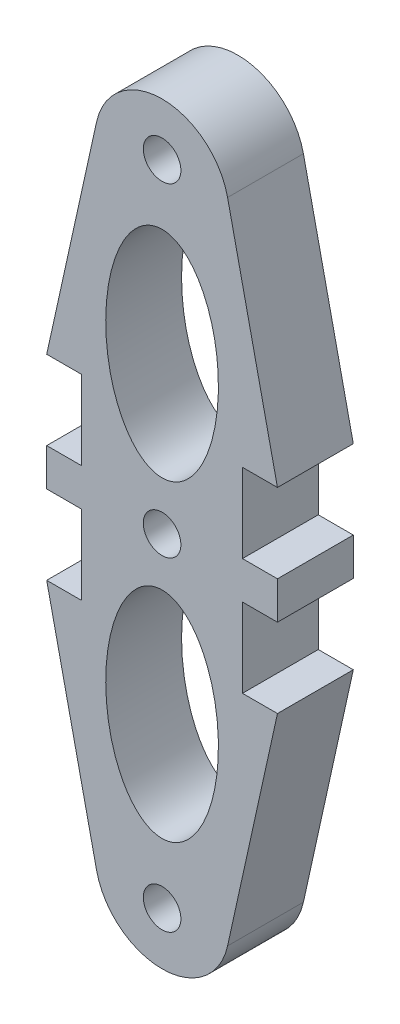
ISO-10303-21;
HEADER;
FILE_DESCRIPTION(('STEP AP214'),'2;1');
FILE_NAME('part.step','',(''),(''),'','','');
FILE_SCHEMA(('AUTOMOTIVE_DESIGN { 1 0 10303 214 1 1 1 1 }'));
ENDSEC;
DATA;
#1=APPLICATION_CONTEXT('core data for automotive mechanical design processes');
#2=APPLICATION_PROTOCOL_DEFINITION('international standard','automotive_design',2000,#1);
#3=PRODUCT_CONTEXT('',#1,'mechanical');
#4=PRODUCT('Part','Part','',(#3));
#5=PRODUCT_RELATED_PRODUCT_CATEGORY('part','',(#4));
#6=PRODUCT_DEFINITION_FORMATION('','',#4);
#7=PRODUCT_DEFINITION_CONTEXT('part definition',#1,'design');
#8=PRODUCT_DEFINITION('design','',#6,#7);
#9=PRODUCT_DEFINITION_SHAPE('','',#8);
#10=(LENGTH_UNIT() NAMED_UNIT(*) SI_UNIT(.MILLI.,.METRE.));
#11=(NAMED_UNIT(*) PLANE_ANGLE_UNIT() SI_UNIT($,.RADIAN.));
#12=(NAMED_UNIT(*) SI_UNIT($,.STERADIAN.) SOLID_ANGLE_UNIT());
#13=UNCERTAINTY_MEASURE_WITH_UNIT(LENGTH_MEASURE(1.E-05),#10,'distance_accuracy_value','');
#14=(GEOMETRIC_REPRESENTATION_CONTEXT(3) GLOBAL_UNCERTAINTY_ASSIGNED_CONTEXT((#13)) GLOBAL_UNIT_ASSIGNED_CONTEXT((#10,
#11,#12)) REPRESENTATION_CONTEXT('',''));
#15=CARTESIAN_POINT('',(0.,0.,0.));
#16=DIRECTION('',(0.,0.,1.));
#17=DIRECTION('',(1.,0.,0.));
#18=AXIS2_PLACEMENT_3D('',#15,#16,#17);
#19=CARTESIAN_POINT('',(838.504600485866,184.873607744956,5.85));
#20=DIRECTION('',(0.976545974076445,0.215308988467939,0.));
#21=DIRECTION('',(-0.215308988467939,0.976545974076445,0.));
#22=AXIS2_PLACEMENT_3D('',#19,#20,#21);
#23=PLANE('',#22);
#24=DIRECTION('',(0.215308988467939,-0.976545974076445,0.));
#25=VECTOR('',#24,1.);
#26=CARTESIAN_POINT('',(838.504600485866,184.873607744956,0.));
#27=LINE('',#26,#25);
#28=CARTESIAN_POINT('',(778.759168708765,455.852359196733,0.));
#29=VERTEX_POINT('',#28);
#30=CARTESIAN_POINT('',(782.606547069337,438.402359196733,0.));
#31=VERTEX_POINT('',#30);
#32=EDGE_CURVE('E314',#29,#31,#27,.T.);
#33=ORIENTED_EDGE('',*,*,#32,.T.);
#34=DIRECTION('',(0.,0.,-1.));
#35=VECTOR('',#34,1.);
#36=CARTESIAN_POINT('',(782.606547069337,438.402359196733,5.85));
#37=LINE('',#36,#35);
#38=CARTESIAN_POINT('',(782.606547069337,438.402359196733,5.85));
#39=VERTEX_POINT('',#38);
#40=EDGE_CURVE('E11',#39,#31,#37,.T.);
#41=ORIENTED_EDGE('',*,*,#40,.F.);
#42=DIRECTION('',(0.215308988467939,-0.976545974076445,0.));
#43=VECTOR('',#42,1.);
#44=CARTESIAN_POINT('',(838.504600485866,184.873607744956,5.85));
#45=LINE('',#44,#43);
#46=CARTESIAN_POINT('',(778.759168708765,455.852359196733,5.85));
#47=VERTEX_POINT('',#46);
#48=EDGE_CURVE('E469',#47,#39,#45,.T.);
#49=ORIENTED_EDGE('',*,*,#48,.F.);
#50=DIRECTION('',(0.,0.,-1.));
#51=VECTOR('',#50,1.);
#52=CARTESIAN_POINT('',(778.759168708765,455.852359196733,5.85));
#53=LINE('',#52,#51);
#54=EDGE_CURVE('E379',#47,#29,#53,.T.);
#55=ORIENTED_EDGE('',*,*,#54,.T.);
#56=EDGE_LOOP('',(#33,#41,#49,#55));
#57=FACE_BOUND('',#56,.T.);
#58=ADVANCED_FACE('F35',(#57),#23,.F.);
#59=CARTESIAN_POINT('',(787.659168708765,439.516361899294,5.85));
#60=DIRECTION('',(0.,0.,-1.));
#61=DIRECTION('',(-1.,0.,0.));
#62=AXIS2_PLACEMENT_3D('',#59,#60,#61);
#63=CYLINDRICAL_SURFACE('',#62,5.17397211555384);
#64=CARTESIAN_POINT('',(787.659168708765,439.516361899294,0.));
#65=DIRECTION('',(0.,0.,1.));
#66=DIRECTION('',(1.,0.,0.));
#67=AXIS2_PLACEMENT_3D('',#64,#65,#66);
#68=CIRCLE('',#67,5.17397211555384);
#69=CARTESIAN_POINT('',(792.711790348193,438.402359196733,0.));
#70=VERTEX_POINT('',#69);
#71=EDGE_CURVE('E318',#31,#70,#68,.T.);
#72=ORIENTED_EDGE('',*,*,#71,.T.);
#73=DIRECTION('',(0.,0.,-1.));
#74=VECTOR('',#73,1.);
#75=CARTESIAN_POINT('',(792.711790348193,438.402359196733,5.85));
#76=LINE('',#75,#74);
#77=CARTESIAN_POINT('',(792.711790348193,438.402359196733,5.85));
#78=VERTEX_POINT('',#77);
#79=EDGE_CURVE('E44',#78,#70,#76,.T.);
#80=ORIENTED_EDGE('',*,*,#79,.F.);
#81=CARTESIAN_POINT('',(787.659168708765,439.516361899294,5.85));
#82=DIRECTION('',(0.,0.,1.));
#83=DIRECTION('',(1.,0.,0.));
#84=AXIS2_PLACEMENT_3D('',#81,#82,#83);
#85=CIRCLE('',#84,5.17397211555384);
#86=EDGE_CURVE('E130',#39,#78,#85,.T.);
#87=ORIENTED_EDGE('',*,*,#86,.F.);
#88=ORIENTED_EDGE('',*,*,#40,.T.);
#89=EDGE_LOOP('',(#72,#80,#87,#88));
#90=FACE_BOUND('',#89,.T.);
#91=ADVANCED_FACE('F294',(#90),#63,.T.);
#92=CARTESIAN_POINT('',(663.78519164697,-146.351448848754,5.85));
#93=DIRECTION('',(-0.976545974076445,0.215308988467939,0.));
#94=DIRECTION('',(-0.215308988467939,-0.976545974076445,0.));
#95=AXIS2_PLACEMENT_3D('',#92,#93,#94);
#96=PLANE('',#95);
#97=DIRECTION('',(0.215308988467939,0.976545974076445,0.));
#98=VECTOR('',#97,1.);
#99=CARTESIAN_POINT('',(663.78519164697,-146.351448848754,0.));
#100=LINE('',#99,#98);
#101=CARTESIAN_POINT('',(796.559168708765,455.852359196733,0.));
#102=VERTEX_POINT('',#101);
#103=EDGE_CURVE('E323',#70,#102,#100,.T.);
#104=ORIENTED_EDGE('',*,*,#103,.T.);
#105=DIRECTION('',(0.,0.,-1.));
#106=VECTOR('',#105,1.);
#107=CARTESIAN_POINT('',(796.559168708765,455.852359196733,5.85));
#108=LINE('',#107,#106);
#109=CARTESIAN_POINT('',(796.559168708765,455.852359196733,5.85));
#110=VERTEX_POINT('',#109);
#111=EDGE_CURVE('E411',#110,#102,#108,.T.);
#112=ORIENTED_EDGE('',*,*,#111,.F.);
#113=DIRECTION('',(0.215308988467939,0.976545974076445,0.));
#114=VECTOR('',#113,1.);
#115=CARTESIAN_POINT('',(663.78519164697,-146.351448848754,5.85));
#116=LINE('',#115,#114);
#117=EDGE_CURVE('E416',#78,#110,#116,.T.);
#118=ORIENTED_EDGE('',*,*,#117,.F.);
#119=ORIENTED_EDGE('',*,*,#79,.T.);
#120=EDGE_LOOP('',(#104,#112,#118,#119));
#121=FACE_BOUND('',#120,.T.);
#122=ADVANCED_FACE('F290',(#121),#96,.F.);
#123=CARTESIAN_POINT('',(9.37218120388744E-12,455.852359196749,5.85));
#124=DIRECTION('',(0.,1.,0.));
#125=DIRECTION('',(-1.,0.,0.));
#126=AXIS2_PLACEMENT_3D('',#123,#124,#125);
#127=PLANE('',#126);
#128=DIRECTION('',(1.,0.,0.));
#129=VECTOR('',#128,1.);
#130=CARTESIAN_POINT('',(9.37218120388744E-12,455.852359196749,0.));
#131=LINE('',#130,#129);
#132=CARTESIAN_POINT('',(793.859168708765,455.852359196733,0.));
#133=VERTEX_POINT('',#132);
#134=EDGE_CURVE('E326',#133,#102,#131,.T.);
#135=ORIENTED_EDGE('',*,*,#134,.F.);
#136=DIRECTION('',(0.,0.,-1.));
#137=VECTOR('',#136,1.);
#138=CARTESIAN_POINT('',(793.859168708765,455.852359196733,5.85));
#139=LINE('',#138,#137);
#140=CARTESIAN_POINT('',(793.859168708765,455.852359196733,5.85));
#141=VERTEX_POINT('',#140);
#142=EDGE_CURVE('E409',#141,#133,#139,.T.);
#143=ORIENTED_EDGE('',*,*,#142,.F.);
#144=DIRECTION('',(1.,0.,0.));
#145=VECTOR('',#144,1.);
#146=CARTESIAN_POINT('',(9.37218120388744E-12,455.852359196749,5.85));
#147=LINE('',#146,#145);
#148=EDGE_CURVE('E426',#141,#110,#147,.T.);
#149=ORIENTED_EDGE('',*,*,#148,.T.);
#150=ORIENTED_EDGE('',*,*,#111,.T.);
#151=EDGE_LOOP('',(#135,#143,#149,#150));
#152=FACE_BOUND('',#151,.T.);
#153=ADVANCED_FACE('F286',(#152),#127,.T.);
#154=CARTESIAN_POINT('',(793.859168708765,0.,5.85));
#155=DIRECTION('',(1.,0.,0.));
#156=DIRECTION('',(0.,0.,-1.));
#157=AXIS2_PLACEMENT_3D('',#154,#155,#156);
#158=PLANE('',#157);
#159=DIRECTION('',(0.,-1.,0.));
#160=VECTOR('',#159,1.);
#161=CARTESIAN_POINT('',(793.859168708765,0.,0.));
#162=LINE('',#161,#160);
#163=CARTESIAN_POINT('',(793.859168708765,461.952359196733,0.));
#164=VERTEX_POINT('',#163);
#165=EDGE_CURVE('E329',#164,#133,#162,.T.);
#166=ORIENTED_EDGE('',*,*,#165,.F.);
#167=DIRECTION('',(0.,0.,-1.));
#168=VECTOR('',#167,1.);
#169=CARTESIAN_POINT('',(793.859168708765,461.952359196733,5.85));
#170=LINE('',#169,#168);
#171=CARTESIAN_POINT('',(793.859168708765,461.952359196733,5.85));
#172=VERTEX_POINT('',#171);
#173=EDGE_CURVE('E407',#172,#164,#170,.T.);
#174=ORIENTED_EDGE('',*,*,#173,.F.);
#175=DIRECTION('',(0.,-1.,0.));
#176=VECTOR('',#175,1.);
#177=CARTESIAN_POINT('',(793.859168708765,0.,5.85));
#178=LINE('',#177,#176);
#179=EDGE_CURVE('E429',#172,#141,#178,.T.);
#180=ORIENTED_EDGE('',*,*,#179,.T.);
#181=ORIENTED_EDGE('',*,*,#142,.T.);
#182=EDGE_LOOP('',(#166,#174,#180,#181));
#183=FACE_BOUND('',#182,.T.);
#184=ADVANCED_FACE('F282',(#183),#158,.T.);
#185=CARTESIAN_POINT('',(9.4975952862988E-12,461.952359196749,5.85));
#186=DIRECTION('',(0.,1.,0.));
#187=DIRECTION('',(-1.,0.,0.));
#188=AXIS2_PLACEMENT_3D('',#185,#186,#187);
#189=PLANE('',#188);
#190=DIRECTION('',(1.,0.,0.));
#191=VECTOR('',#190,1.);
#192=CARTESIAN_POINT('',(9.4975952862988E-12,461.952359196749,0.));
#193=LINE('',#192,#191);
#194=CARTESIAN_POINT('',(796.559168708765,461.952359196733,0.));
#195=VERTEX_POINT('',#194);
#196=EDGE_CURVE('E332',#164,#195,#193,.T.);
#197=ORIENTED_EDGE('',*,*,#196,.T.);
#198=DIRECTION('',(0.,0.,-1.));
#199=VECTOR('',#198,1.);
#200=CARTESIAN_POINT('',(796.559168708765,461.952359196733,5.85));
#201=LINE('',#200,#199);
#202=CARTESIAN_POINT('',(796.559168708765,461.952359196733,5.85));
#203=VERTEX_POINT('',#202);
#204=EDGE_CURVE('E405',#203,#195,#201,.T.);
#205=ORIENTED_EDGE('',*,*,#204,.F.);
#206=DIRECTION('',(1.,0.,0.));
#207=VECTOR('',#206,1.);
#208=CARTESIAN_POINT('',(9.4975952862988E-12,461.952359196749,5.85));
#209=LINE('',#208,#207);
#210=EDGE_CURVE('E431',#172,#203,#209,.T.);
#211=ORIENTED_EDGE('',*,*,#210,.F.);
#212=ORIENTED_EDGE('',*,*,#173,.T.);
#213=EDGE_LOOP('',(#197,#205,#211,#212));
#214=FACE_BOUND('',#213,.T.);
#215=ADVANCED_FACE('F278',(#214),#189,.F.);
#216=CARTESIAN_POINT('',(796.559168708765,0.,5.85));
#217=DIRECTION('',(1.,0.,0.));
#218=DIRECTION('',(0.,0.,-1.));
#219=AXIS2_PLACEMENT_3D('',#216,#217,#218);
#220=PLANE('',#219);
#221=DIRECTION('',(0.,-1.,0.));
#222=VECTOR('',#221,1.);
#223=CARTESIAN_POINT('',(796.559168708765,0.,0.));
#224=LINE('',#223,#222);
#225=CARTESIAN_POINT('',(796.559168708765,464.852359196733,0.));
#226=VERTEX_POINT('',#225);
#227=EDGE_CURVE('E335',#226,#195,#224,.T.);
#228=ORIENTED_EDGE('',*,*,#227,.F.);
#229=DIRECTION('',(0.,0.,-1.));
#230=VECTOR('',#229,1.);
#231=CARTESIAN_POINT('',(796.559168708765,464.852359196733,5.85));
#232=LINE('',#231,#230);
#233=CARTESIAN_POINT('',(796.559168708765,464.852359196733,5.85));
#234=VERTEX_POINT('',#233);
#235=EDGE_CURVE('E403',#234,#226,#232,.T.);
#236=ORIENTED_EDGE('',*,*,#235,.F.);
#237=DIRECTION('',(0.,-1.,0.));
#238=VECTOR('',#237,1.);
#239=CARTESIAN_POINT('',(796.559168708765,0.,5.85));
#240=LINE('',#239,#238);
#241=EDGE_CURVE('E437',#234,#203,#240,.T.);
#242=ORIENTED_EDGE('',*,*,#241,.T.);
#243=ORIENTED_EDGE('',*,*,#204,.T.);
#244=EDGE_LOOP('',(#228,#236,#242,#243));
#245=FACE_BOUND('',#244,.T.);
#246=ADVANCED_FACE('F274',(#245),#220,.T.);
#247=CARTESIAN_POINT('',(-9.55721837465762E-12,464.852359196716,5.85));
#248=DIRECTION('',(0.,1.,0.));
#249=DIRECTION('',(-1.,0.,0.));
#250=AXIS2_PLACEMENT_3D('',#247,#248,#249);
#251=PLANE('',#250);
#252=DIRECTION('',(1.,0.,0.));
#253=VECTOR('',#252,1.);
#254=CARTESIAN_POINT('',(-9.55721837465762E-12,464.852359196716,0.));
#255=LINE('',#254,#253);
#256=CARTESIAN_POINT('',(793.859168708765,464.852359196733,0.));
#257=VERTEX_POINT('',#256);
#258=EDGE_CURVE('E338',#257,#226,#255,.T.);
#259=ORIENTED_EDGE('',*,*,#258,.F.);
#260=DIRECTION('',(0.,0.,-1.));
#261=VECTOR('',#260,1.);
#262=CARTESIAN_POINT('',(793.859168708765,464.852359196733,5.85));
#263=LINE('',#262,#261);
#264=CARTESIAN_POINT('',(793.859168708765,464.852359196733,5.85));
#265=VERTEX_POINT('',#264);
#266=EDGE_CURVE('E401',#265,#257,#263,.T.);
#267=ORIENTED_EDGE('',*,*,#266,.F.);
#268=DIRECTION('',(1.,0.,0.));
#269=VECTOR('',#268,1.);
#270=CARTESIAN_POINT('',(-9.55721837465762E-12,464.852359196716,5.85));
#271=LINE('',#270,#269);
#272=EDGE_CURVE('E440',#265,#234,#271,.T.);
#273=ORIENTED_EDGE('',*,*,#272,.T.);
#274=ORIENTED_EDGE('',*,*,#235,.T.);
#275=EDGE_LOOP('',(#259,#267,#273,#274));
#276=FACE_BOUND('',#275,.T.);
#277=ADVANCED_FACE('F270',(#276),#251,.T.);
#278=CARTESIAN_POINT('',(793.859168708765,0.,5.85));
#279=DIRECTION('',(-1.,0.,0.));
#280=DIRECTION('',(0.,0.,1.));
#281=AXIS2_PLACEMENT_3D('',#278,#279,#280);
#282=PLANE('',#281);
#283=DIRECTION('',(0.,1.,0.));
#284=VECTOR('',#283,1.);
#285=CARTESIAN_POINT('',(793.859168708765,0.,0.));
#286=LINE('',#285,#284);
#287=CARTESIAN_POINT('',(793.859168708765,470.952359196733,0.));
#288=VERTEX_POINT('',#287);
#289=EDGE_CURVE('E341',#257,#288,#286,.T.);
#290=ORIENTED_EDGE('',*,*,#289,.T.);
#291=DIRECTION('',(0.,0.,-1.));
#292=VECTOR('',#291,1.);
#293=CARTESIAN_POINT('',(793.859168708765,470.952359196733,5.85));
#294=LINE('',#293,#292);
#295=CARTESIAN_POINT('',(793.859168708765,470.952359196733,5.85));
#296=VERTEX_POINT('',#295);
#297=EDGE_CURVE('E398',#296,#288,#294,.T.);
#298=ORIENTED_EDGE('',*,*,#297,.F.);
#299=DIRECTION('',(0.,1.,0.));
#300=VECTOR('',#299,1.);
#301=CARTESIAN_POINT('',(793.859168708765,0.,5.85));
#302=LINE('',#301,#300);
#303=EDGE_CURVE('E443',#265,#296,#302,.T.);
#304=ORIENTED_EDGE('',*,*,#303,.F.);
#305=ORIENTED_EDGE('',*,*,#266,.T.);
#306=EDGE_LOOP('',(#290,#298,#304,#305));
#307=FACE_BOUND('',#306,.T.);
#308=ADVANCED_FACE('F266',(#307),#282,.F.);
#309=CARTESIAN_POINT('',(-9.68263245706898E-12,470.952359196717,5.85));
#310=DIRECTION('',(0.,1.,0.));
#311=DIRECTION('',(-1.,0.,0.));
#312=AXIS2_PLACEMENT_3D('',#309,#310,#311);
#313=PLANE('',#312);
#314=DIRECTION('',(1.,0.,0.));
#315=VECTOR('',#314,1.);
#316=CARTESIAN_POINT('',(-9.68263245706898E-12,470.952359196717,0.));
#317=LINE('',#316,#315);
#318=CARTESIAN_POINT('',(796.559168708765,470.952359196733,0.));
#319=VERTEX_POINT('',#318);
#320=EDGE_CURVE('E343',#288,#319,#317,.T.);
#321=ORIENTED_EDGE('',*,*,#320,.T.);
#322=DIRECTION('',(0.,0.,-1.));
#323=VECTOR('',#322,1.);
#324=CARTESIAN_POINT('',(796.559168708765,470.952359196733,5.85));
#325=LINE('',#324,#323);
#326=CARTESIAN_POINT('',(796.559168708765,470.952359196733,5.85));
#327=VERTEX_POINT('',#326);
#328=EDGE_CURVE('E396',#327,#319,#325,.T.);
#329=ORIENTED_EDGE('',*,*,#328,.F.);
#330=DIRECTION('',(1.,0.,0.));
#331=VECTOR('',#330,1.);
#332=CARTESIAN_POINT('',(-9.68263245706898E-12,470.952359196717,5.85));
#333=LINE('',#332,#331);
#334=EDGE_CURVE('E445',#296,#327,#333,.T.);
#335=ORIENTED_EDGE('',*,*,#334,.F.);
#336=ORIENTED_EDGE('',*,*,#297,.T.);
#337=EDGE_LOOP('',(#321,#329,#335,#336));
#338=FACE_BOUND('',#337,.T.);
#339=ADVANCED_FACE('F262',(#338),#313,.F.);
#340=CARTESIAN_POINT('',(858.654341589348,189.316225389236,5.85));
#341=DIRECTION('',(0.976545974076445,0.21530898846794,0.));
#342=DIRECTION('',(-0.21530898846794,0.976545974076445,0.));
#343=AXIS2_PLACEMENT_3D('',#340,#341,#342);
#344=PLANE('',#343);
#345=DIRECTION('',(0.21530898846794,-0.976545974076445,0.));
#346=VECTOR('',#345,1.);
#347=CARTESIAN_POINT('',(858.654341589348,189.316225389236,0.));
#348=LINE('',#347,#346);
#349=CARTESIAN_POINT('',(792.711790348193,488.402359196733,0.));
#350=VERTEX_POINT('',#349);
#351=EDGE_CURVE('E346',#350,#319,#348,.T.);
#352=ORIENTED_EDGE('',*,*,#351,.F.);
#353=DIRECTION('',(0.,0.,-1.));
#354=VECTOR('',#353,1.);
#355=CARTESIAN_POINT('',(792.711790348193,488.402359196733,5.85));
#356=LINE('',#355,#354);
#357=CARTESIAN_POINT('',(792.711790348193,488.402359196733,5.85));
#358=VERTEX_POINT('',#357);
#359=EDGE_CURVE('E394',#358,#350,#356,.T.);
#360=ORIENTED_EDGE('',*,*,#359,.F.);
#361=DIRECTION('',(0.21530898846794,-0.976545974076445,0.));
#362=VECTOR('',#361,1.);
#363=CARTESIAN_POINT('',(858.654341589348,189.316225389236,5.85));
#364=LINE('',#363,#362);
#365=EDGE_CURVE('E447',#358,#327,#364,.T.);
#366=ORIENTED_EDGE('',*,*,#365,.T.);
#367=ORIENTED_EDGE('',*,*,#328,.T.);
#368=EDGE_LOOP('',(#352,#360,#366,#367));
#369=FACE_BOUND('',#368,.T.);
#370=ADVANCED_FACE('F258',(#369),#344,.T.);
#371=CARTESIAN_POINT('',(787.659168708765,487.288356494172,5.85));
#372=DIRECTION('',(0.,0.,-1.));
#373=DIRECTION('',(-1.,0.,0.));
#374=AXIS2_PLACEMENT_3D('',#371,#372,#373);
#375=CYLINDRICAL_SURFACE('',#374,5.17397211555384);
#376=CARTESIAN_POINT('',(787.659168708765,487.288356494172,0.));
#377=DIRECTION('',(0.,0.,1.));
#378=DIRECTION('',(1.,0.,0.));
#379=AXIS2_PLACEMENT_3D('',#376,#377,#378);
#380=CIRCLE('',#379,5.17397211555384);
#381=CARTESIAN_POINT('',(782.606547069337,488.402359196733,0.));
#382=VERTEX_POINT('',#381);
#383=EDGE_CURVE('E349',#382,#350,#380,.F.);
#384=ORIENTED_EDGE('',*,*,#383,.F.);
#385=DIRECTION('',(0.,0.,-1.));
#386=VECTOR('',#385,1.);
#387=CARTESIAN_POINT('',(782.606547069337,488.402359196733,5.85));
#388=LINE('',#387,#386);
#389=CARTESIAN_POINT('',(782.606547069337,488.402359196733,5.85));
#390=VERTEX_POINT('',#389);
#391=EDGE_CURVE('E392',#390,#382,#388,.T.);
#392=ORIENTED_EDGE('',*,*,#391,.F.);
#393=CARTESIAN_POINT('',(787.659168708765,487.288356494172,5.85));
#394=DIRECTION('',(0.,0.,1.));
#395=DIRECTION('',(1.,0.,0.));
#396=AXIS2_PLACEMENT_3D('',#393,#394,#395);
#397=CIRCLE('',#396,5.17397211555384);
#398=EDGE_CURVE('E450',#390,#358,#397,.F.);
#399=ORIENTED_EDGE('',*,*,#398,.T.);
#400=ORIENTED_EDGE('',*,*,#359,.T.);
#401=EDGE_LOOP('',(#384,#392,#399,#400));
#402=FACE_BOUND('',#401,.T.);
#403=ADVANCED_FACE('F254',(#402),#375,.T.);
#404=CARTESIAN_POINT('',(643.635450543488,-141.908831204476,5.85));
#405=DIRECTION('',(-0.976545974076445,0.21530898846794,0.));
#406=DIRECTION('',(-0.21530898846794,-0.976545974076445,0.));
#407=AXIS2_PLACEMENT_3D('',#404,#405,#406);
#408=PLANE('',#407);
#409=DIRECTION('',(0.21530898846794,0.976545974076445,0.));
#410=VECTOR('',#409,1.);
#411=CARTESIAN_POINT('',(643.635450543488,-141.908831204476,0.));
#412=LINE('',#411,#410);
#413=CARTESIAN_POINT('',(778.759168708765,470.952359196733,0.));
#414=VERTEX_POINT('',#413);
#415=EDGE_CURVE('E352',#414,#382,#412,.T.);
#416=ORIENTED_EDGE('',*,*,#415,.F.);
#417=DIRECTION('',(0.,0.,-1.));
#418=VECTOR('',#417,1.);
#419=CARTESIAN_POINT('',(778.759168708765,470.952359196733,5.85));
#420=LINE('',#419,#418);
#421=CARTESIAN_POINT('',(778.759168708765,470.952359196733,5.85));
#422=VERTEX_POINT('',#421);
#423=EDGE_CURVE('E390',#422,#414,#420,.T.);
#424=ORIENTED_EDGE('',*,*,#423,.F.);
#425=DIRECTION('',(0.21530898846794,0.976545974076445,0.));
#426=VECTOR('',#425,1.);
#427=CARTESIAN_POINT('',(643.635450543488,-141.908831204476,5.85));
#428=LINE('',#427,#426);
#429=EDGE_CURVE('E453',#422,#390,#428,.T.);
#430=ORIENTED_EDGE('',*,*,#429,.T.);
#431=ORIENTED_EDGE('',*,*,#391,.T.);
#432=EDGE_LOOP('',(#416,#424,#430,#431));
#433=FACE_BOUND('',#432,.T.);
#434=ADVANCED_FACE('F250',(#433),#408,.T.);
#435=CARTESIAN_POINT('',(9.68263245706964E-12,470.952359196749,5.85));
#436=DIRECTION('',(0.,-1.,0.));
#437=DIRECTION('',(1.,0.,0.));
#438=AXIS2_PLACEMENT_3D('',#435,#436,#437);
#439=PLANE('',#438);
#440=DIRECTION('',(-1.,0.,0.));
#441=VECTOR('',#440,1.);
#442=CARTESIAN_POINT('',(9.68263245706964E-12,470.952359196749,0.));
#443=LINE('',#442,#441);
#444=CARTESIAN_POINT('',(781.459168708765,470.952359196733,0.));
#445=VERTEX_POINT('',#444);
#446=EDGE_CURVE('E355',#445,#414,#443,.T.);
#447=ORIENTED_EDGE('',*,*,#446,.F.);
#448=DIRECTION('',(0.,0.,-1.));
#449=VECTOR('',#448,1.);
#450=CARTESIAN_POINT('',(781.459168708765,470.952359196733,5.85));
#451=LINE('',#450,#449);
#452=CARTESIAN_POINT('',(781.459168708765,470.952359196733,5.85));
#453=VERTEX_POINT('',#452);
#454=EDGE_CURVE('E388',#453,#445,#451,.T.);
#455=ORIENTED_EDGE('',*,*,#454,.F.);
#456=DIRECTION('',(-1.,0.,0.));
#457=VECTOR('',#456,1.);
#458=CARTESIAN_POINT('',(9.68263245706964E-12,470.952359196749,5.85));
#459=LINE('',#458,#457);
#460=EDGE_CURVE('E456',#453,#422,#459,.T.);
#461=ORIENTED_EDGE('',*,*,#460,.T.);
#462=ORIENTED_EDGE('',*,*,#423,.T.);
#463=EDGE_LOOP('',(#447,#455,#461,#462));
#464=FACE_BOUND('',#463,.T.);
#465=ADVANCED_FACE('F246',(#464),#439,.T.);
#466=CARTESIAN_POINT('',(781.459168708765,0.,5.85));
#467=DIRECTION('',(-1.,0.,0.));
#468=DIRECTION('',(0.,0.,1.));
#469=AXIS2_PLACEMENT_3D('',#466,#467,#468);
#470=PLANE('',#469);
#471=DIRECTION('',(0.,1.,0.));
#472=VECTOR('',#471,1.);
#473=CARTESIAN_POINT('',(781.459168708765,0.,0.));
#474=LINE('',#473,#472);
#475=CARTESIAN_POINT('',(781.459168708765,464.852359196733,0.));
#476=VERTEX_POINT('',#475);
#477=EDGE_CURVE('E358',#476,#445,#474,.T.);
#478=ORIENTED_EDGE('',*,*,#477,.F.);
#479=DIRECTION('',(0.,0.,-1.));
#480=VECTOR('',#479,1.);
#481=CARTESIAN_POINT('',(781.459168708765,464.852359196733,5.85));
#482=LINE('',#481,#480);
#483=CARTESIAN_POINT('',(781.459168708765,464.852359196733,5.85));
#484=VERTEX_POINT('',#483);
#485=EDGE_CURVE('E386',#484,#476,#482,.T.);
#486=ORIENTED_EDGE('',*,*,#485,.F.);
#487=DIRECTION('',(0.,1.,0.));
#488=VECTOR('',#487,1.);
#489=CARTESIAN_POINT('',(781.459168708765,0.,5.85));
#490=LINE('',#489,#488);
#491=EDGE_CURVE('E459',#484,#453,#490,.T.);
#492=ORIENTED_EDGE('',*,*,#491,.T.);
#493=ORIENTED_EDGE('',*,*,#454,.T.);
#494=EDGE_LOOP('',(#478,#486,#492,#493));
#495=FACE_BOUND('',#494,.T.);
#496=ADVANCED_FACE('F242',(#495),#470,.T.);
#497=CARTESIAN_POINT('',(9.55721837465828E-12,464.852359196749,5.85));
#498=DIRECTION('',(0.,-1.,0.));
#499=DIRECTION('',(1.,0.,0.));
#500=AXIS2_PLACEMENT_3D('',#497,#498,#499);
#501=PLANE('',#500);
#502=DIRECTION('',(-1.,0.,0.));
#503=VECTOR('',#502,1.);
#504=CARTESIAN_POINT('',(9.55721837465828E-12,464.852359196749,0.));
#505=LINE('',#504,#503);
#506=CARTESIAN_POINT('',(778.759168708765,464.852359196733,0.));
#507=VERTEX_POINT('',#506);
#508=EDGE_CURVE('E361',#476,#507,#505,.T.);
#509=ORIENTED_EDGE('',*,*,#508,.T.);
#510=DIRECTION('',(0.,0.,-1.));
#511=VECTOR('',#510,1.);
#512=CARTESIAN_POINT('',(778.759168708765,464.852359196733,5.85));
#513=LINE('',#512,#511);
#514=CARTESIAN_POINT('',(778.759168708765,464.852359196733,5.85));
#515=VERTEX_POINT('',#514);
#516=EDGE_CURVE('E383',#515,#507,#513,.T.);
#517=ORIENTED_EDGE('',*,*,#516,.F.);
#518=DIRECTION('',(-1.,0.,0.));
#519=VECTOR('',#518,1.);
#520=CARTESIAN_POINT('',(9.55721837465828E-12,464.852359196749,5.85));
#521=LINE('',#520,#519);
#522=EDGE_CURVE('E200',#484,#515,#521,.T.);
#523=ORIENTED_EDGE('',*,*,#522,.F.);
#524=ORIENTED_EDGE('',*,*,#485,.T.);
#525=EDGE_LOOP('',(#509,#517,#523,#524));
#526=FACE_BOUND('',#525,.T.);
#527=ADVANCED_FACE('F238',(#526),#501,.F.);
#528=CARTESIAN_POINT('',(778.759168708765,0.,5.85));
#529=DIRECTION('',(1.,0.,0.));
#530=DIRECTION('',(0.,0.,-1.));
#531=AXIS2_PLACEMENT_3D('',#528,#529,#530);
#532=PLANE('',#531);
#533=DIRECTION('',(0.,-1.,0.));
#534=VECTOR('',#533,1.);
#535=CARTESIAN_POINT('',(778.759168708765,0.,0.));
#536=LINE('',#535,#534);
#537=CARTESIAN_POINT('',(778.759168708765,461.952359196733,0.));
#538=VERTEX_POINT('',#537);
#539=EDGE_CURVE('E363',#507,#538,#536,.T.);
#540=ORIENTED_EDGE('',*,*,#539,.T.);
#541=DIRECTION('',(0.,0.,-1.));
#542=VECTOR('',#541,1.);
#543=CARTESIAN_POINT('',(778.759168708765,461.952359196733,5.85));
#544=LINE('',#543,#542);
#545=CARTESIAN_POINT('',(778.759168708765,461.952359196733,5.85));
#546=VERTEX_POINT('',#545);
#547=EDGE_CURVE('E188',#546,#538,#544,.T.);
#548=ORIENTED_EDGE('',*,*,#547,.F.);
#549=DIRECTION('',(0.,-1.,0.));
#550=VECTOR('',#549,1.);
#551=CARTESIAN_POINT('',(778.759168708765,0.,5.85));
#552=LINE('',#551,#550);
#553=EDGE_CURVE('E197',#515,#546,#552,.T.);
#554=ORIENTED_EDGE('',*,*,#553,.F.);
#555=ORIENTED_EDGE('',*,*,#516,.T.);
#556=EDGE_LOOP('',(#540,#548,#554,#555));
#557=FACE_BOUND('',#556,.T.);
#558=ADVANCED_FACE('F235',(#557),#532,.F.);
#559=CARTESIAN_POINT('',(-9.49759528629813E-12,461.952359196717,5.85));
#560=DIRECTION('',(0.,-1.,0.));
#561=DIRECTION('',(1.,0.,0.));
#562=AXIS2_PLACEMENT_3D('',#559,#560,#561);
#563=PLANE('',#562);
#564=DIRECTION('',(-1.,0.,0.));
#565=VECTOR('',#564,1.);
#566=CARTESIAN_POINT('',(-9.49759528629813E-12,461.952359196717,0.));
#567=LINE('',#566,#565);
#568=CARTESIAN_POINT('',(781.459168708765,461.952359196733,0.));
#569=VERTEX_POINT('',#568);
#570=EDGE_CURVE('E187',#569,#538,#567,.T.);
#571=ORIENTED_EDGE('',*,*,#570,.F.);
#572=DIRECTION('',(0.,0.,-1.));
#573=VECTOR('',#572,1.);
#574=CARTESIAN_POINT('',(781.459168708765,461.952359196733,5.85));
#575=LINE('',#574,#573);
#576=CARTESIAN_POINT('',(781.459168708765,461.952359196733,5.85));
#577=VERTEX_POINT('',#576);
#578=EDGE_CURVE('E181',#577,#569,#575,.T.);
#579=ORIENTED_EDGE('',*,*,#578,.F.);
#580=DIRECTION('',(-1.,0.,0.));
#581=VECTOR('',#580,1.);
#582=CARTESIAN_POINT('',(-9.49759528629813E-12,461.952359196717,5.85));
#583=LINE('',#582,#581);
#584=EDGE_CURVE('E185',#577,#546,#583,.T.);
#585=ORIENTED_EDGE('',*,*,#584,.T.);
#586=ORIENTED_EDGE('',*,*,#547,.T.);
#587=EDGE_LOOP('',(#571,#579,#585,#586));
#588=FACE_BOUND('',#587,.T.);
#589=ADVANCED_FACE('F183',(#588),#563,.T.);
#590=CARTESIAN_POINT('',(781.459168708765,0.,5.85));
#591=DIRECTION('',(1.,0.,0.));
#592=DIRECTION('',(0.,0.,-1.));
#593=AXIS2_PLACEMENT_3D('',#590,#591,#592);
#594=PLANE('',#593);
#595=DIRECTION('',(0.,-1.,0.));
#596=VECTOR('',#595,1.);
#597=CARTESIAN_POINT('',(781.459168708765,0.,0.));
#598=LINE('',#597,#596);
#599=CARTESIAN_POINT('',(781.459168708765,455.852359196733,0.));
#600=VERTEX_POINT('',#599);
#601=EDGE_CURVE('E116',#569,#600,#598,.T.);
#602=ORIENTED_EDGE('',*,*,#601,.T.);
#603=DIRECTION('',(0.,0.,-1.));
#604=VECTOR('',#603,1.);
#605=CARTESIAN_POINT('',(781.459168708765,455.852359196733,5.85));
#606=LINE('',#605,#604);
#607=CARTESIAN_POINT('',(781.459168708765,455.852359196733,5.85));
#608=VERTEX_POINT('',#607);
#609=EDGE_CURVE('E189',#608,#600,#606,.T.);
#610=ORIENTED_EDGE('',*,*,#609,.F.);
#611=DIRECTION('',(0.,-1.,0.));
#612=VECTOR('',#611,1.);
#613=CARTESIAN_POINT('',(781.459168708765,0.,5.85));
#614=LINE('',#613,#612);
#615=EDGE_CURVE('E191',#577,#608,#614,.T.);
#616=ORIENTED_EDGE('',*,*,#615,.F.);
#617=ORIENTED_EDGE('',*,*,#578,.T.);
#618=EDGE_LOOP('',(#602,#610,#616,#617));
#619=FACE_BOUND('',#618,.T.);
#620=ADVANCED_FACE('F192',(#619),#594,.F.);
#621=CARTESIAN_POINT('',(787.659168708765,475.44811823758,5.85));
#622=DIRECTION('',(0.,0.,1.));
#623=DIRECTION('',(0.,1.,0.));
#624=AXIS2_PLACEMENT_3D('',#621,#622,#623);
#625=ELLIPSE('',#624,8.30208055455728,4.34649741649051);
#626=DIRECTION('',(0.,0.,-1.));
#627=VECTOR('',#626,1.);
#628=SURFACE_OF_LINEAR_EXTRUSION('',#625,#627);
#629=CARTESIAN_POINT('',(787.659168708765,483.750198792137,5.85));
#630=VERTEX_POINT('',#629);
#631=EDGE_CURVE('E208',#630,#630,#625,.T.);
#632=ORIENTED_EDGE('',*,*,#631,.T.);
#633=EDGE_LOOP('',(#632));
#634=FACE_BOUND('',#633,.T.);
#635=CARTESIAN_POINT('',(787.659168708765,475.44811823758,0.));
#636=DIRECTION('',(0.,0.,1.));
#637=DIRECTION('',(0.,1.,0.));
#638=AXIS2_PLACEMENT_3D('',#635,#636,#637);
#639=ELLIPSE('',#638,8.30208055455728,4.34649741649051);
#640=CARTESIAN_POINT('',(787.659168708765,483.750198792137,0.));
#641=VERTEX_POINT('',#640);
#642=EDGE_CURVE('E372',#641,#641,#639,.T.);
#643=ORIENTED_EDGE('',*,*,#642,.F.);
#644=EDGE_LOOP('',(#643));
#645=FACE_BOUND('',#644,.T.);
#646=ADVANCED_FACE('F216',(#634,#645),#628,.T.);
#647=CARTESIAN_POINT('',(787.659168708765,463.402359196733,5.85));
#648=DIRECTION('',(0.,0.,-1.));
#649=DIRECTION('',(-1.,0.,0.));
#650=AXIS2_PLACEMENT_3D('',#647,#648,#649);
#651=CYLINDRICAL_SURFACE('',#650,1.44999999999994);
#652=CARTESIAN_POINT('',(787.659168708765,463.402359196733,5.85));
#653=DIRECTION('',(0.,0.,1.));
#654=DIRECTION('',(1.,0.,0.));
#655=AXIS2_PLACEMENT_3D('',#652,#653,#654);
#656=CIRCLE('',#655,1.44999999999994);
#657=CARTESIAN_POINT('',(789.109168708765,463.402359196733,5.85));
#658=VERTEX_POINT('',#657);
#659=EDGE_CURVE('E205',#658,#658,#656,.T.);
#660=ORIENTED_EDGE('',*,*,#659,.T.);
#661=EDGE_LOOP('',(#660));
#662=FACE_BOUND('',#661,.T.);
#663=CARTESIAN_POINT('',(787.659168708765,463.402359196733,0.));
#664=DIRECTION('',(0.,0.,1.));
#665=DIRECTION('',(1.,0.,0.));
#666=AXIS2_PLACEMENT_3D('',#663,#664,#665);
#667=CIRCLE('',#666,1.44999999999994);
#668=CARTESIAN_POINT('',(789.109168708765,463.402359196733,0.));
#669=VERTEX_POINT('',#668);
#670=EDGE_CURVE('E369',#669,#669,#667,.T.);
#671=ORIENTED_EDGE('',*,*,#670,.F.);
#672=EDGE_LOOP('',(#671));
#673=FACE_BOUND('',#672,.T.);
#674=ADVANCED_FACE('F220',(#662,#673),#651,.F.);
#675=CARTESIAN_POINT('',(-9.37218120388677E-12,455.852359196717,5.85));
#676=DIRECTION('',(0.,-1.,0.));
#677=DIRECTION('',(1.,0.,0.));
#678=AXIS2_PLACEMENT_3D('',#675,#676,#677);
#679=PLANE('',#678);
#680=DIRECTION('',(-1.,0.,0.));
#681=VECTOR('',#680,1.);
#682=CARTESIAN_POINT('',(-9.37218120388677E-12,455.852359196717,0.));
#683=LINE('',#682,#681);
#684=EDGE_CURVE('E122',#600,#29,#683,.T.);
#685=ORIENTED_EDGE('',*,*,#684,.T.);
#686=ORIENTED_EDGE('',*,*,#54,.F.);
#687=DIRECTION('',(-1.,0.,0.));
#688=VECTOR('',#687,1.);
#689=CARTESIAN_POINT('',(-9.37218120388677E-12,455.852359196717,5.85));
#690=LINE('',#689,#688);
#691=EDGE_CURVE('E52',#608,#47,#690,.T.);
#692=ORIENTED_EDGE('',*,*,#691,.F.);
#693=ORIENTED_EDGE('',*,*,#609,.T.);
#694=EDGE_LOOP('',(#685,#686,#692,#693));
#695=FACE_BOUND('',#694,.T.);
#696=ADVANCED_FACE('F226',(#695),#679,.F.);
#697=CARTESIAN_POINT('',(787.659168708765,488.402359196733,5.85));
#698=DIRECTION('',(0.,0.,-1.));
#699=DIRECTION('',(-1.,0.,0.));
#700=AXIS2_PLACEMENT_3D('',#697,#698,#699);
#701=CYLINDRICAL_SURFACE('',#700,1.44999999999994);
#702=CARTESIAN_POINT('',(787.659168708765,488.402359196733,5.85));
#703=DIRECTION('',(0.,0.,1.));
#704=DIRECTION('',(1.,0.,0.));
#705=AXIS2_PLACEMENT_3D('',#702,#703,#704);
#706=CIRCLE('',#705,1.44999999999994);
#707=CARTESIAN_POINT('',(789.109168708765,488.402359196733,5.85));
#708=VERTEX_POINT('',#707);
#709=EDGE_CURVE('E309',#708,#708,#706,.T.);
#710=ORIENTED_EDGE('',*,*,#709,.T.);
#711=EDGE_LOOP('',(#710));
#712=FACE_BOUND('',#711,.T.);
#713=CARTESIAN_POINT('',(787.659168708765,488.402359196733,0.));
#714=DIRECTION('',(0.,0.,1.));
#715=DIRECTION('',(1.,0.,0.));
#716=AXIS2_PLACEMENT_3D('',#713,#714,#715);
#717=CIRCLE('',#716,1.44999999999994);
#718=CARTESIAN_POINT('',(789.109168708765,488.402359196733,0.));
#719=VERTEX_POINT('',#718);
#720=EDGE_CURVE('E312',#719,#719,#717,.T.);
#721=ORIENTED_EDGE('',*,*,#720,.F.);
#722=EDGE_LOOP('',(#721));
#723=FACE_BOUND('',#722,.T.);
#724=ADVANCED_FACE('F230',(#712,#723),#701,.F.);
#725=CARTESIAN_POINT('',(787.659168708765,438.402359196733,5.85));
#726=DIRECTION('',(0.,0.,-1.));
#727=DIRECTION('',(-1.,0.,0.));
#728=AXIS2_PLACEMENT_3D('',#725,#726,#727);
#729=CYLINDRICAL_SURFACE('',#728,1.44999999999994);
#730=CARTESIAN_POINT('',(787.659168708765,438.402359196733,5.85));
#731=DIRECTION('',(0.,0.,1.));
#732=DIRECTION('',(1.,0.,0.));
#733=AXIS2_PLACEMENT_3D('',#730,#731,#732);
#734=CIRCLE('',#733,1.44999999999994);
#735=CARTESIAN_POINT('',(789.109168708765,438.402359196733,5.85));
#736=VERTEX_POINT('',#735);
#737=EDGE_CURVE('E378',#736,#736,#734,.F.);
#738=ORIENTED_EDGE('',*,*,#737,.F.);
#739=EDGE_LOOP('',(#738));
#740=FACE_BOUND('',#739,.T.);
#741=CARTESIAN_POINT('',(787.659168708765,438.402359196733,0.));
#742=DIRECTION('',(0.,0.,1.));
#743=DIRECTION('',(1.,0.,0.));
#744=AXIS2_PLACEMENT_3D('',#741,#742,#743);
#745=CIRCLE('',#744,1.44999999999994);
#746=CARTESIAN_POINT('',(789.109168708765,438.402359196733,0.));
#747=VERTEX_POINT('',#746);
#748=EDGE_CURVE('E315',#747,#747,#745,.F.);
#749=ORIENTED_EDGE('',*,*,#748,.T.);
#750=EDGE_LOOP('',(#749));
#751=FACE_BOUND('',#750,.T.);
#752=ADVANCED_FACE('F37',(#740,#751),#729,.F.);
#753=CARTESIAN_POINT('',(787.659168708765,451.356600155886,5.85));
#754=DIRECTION('',(0.,0.,-1.));
#755=DIRECTION('',(0.,-1.,0.));
#756=AXIS2_PLACEMENT_3D('',#753,#754,#755);
#757=ELLIPSE('',#756,8.30208055455728,4.34649741649051);
#758=DIRECTION('',(0.,0.,-1.));
#759=VECTOR('',#758,1.);
#760=SURFACE_OF_LINEAR_EXTRUSION('',#757,#759);
#761=CARTESIAN_POINT('',(787.659168708765,443.054519601329,5.85));
#762=VERTEX_POINT('',#761);
#763=EDGE_CURVE('E212',#762,#762,#757,.T.);
#764=ORIENTED_EDGE('',*,*,#763,.F.);
#765=EDGE_LOOP('',(#764));
#766=FACE_BOUND('',#765,.T.);
#767=CARTESIAN_POINT('',(787.659168708765,451.356600155886,0.));
#768=DIRECTION('',(0.,0.,-1.));
#769=DIRECTION('',(0.,-1.,0.));
#770=AXIS2_PLACEMENT_3D('',#767,#768,#769);
#771=ELLIPSE('',#770,8.30208055455728,4.34649741649051);
#772=CARTESIAN_POINT('',(787.659168708765,443.054519601329,0.));
#773=VERTEX_POINT('',#772);
#774=EDGE_CURVE('E375',#773,#773,#771,.T.);
#775=ORIENTED_EDGE('',*,*,#774,.T.);
#776=EDGE_LOOP('',(#775));
#777=FACE_BOUND('',#776,.T.);
#778=ADVANCED_FACE('F222',(#766,#777),#760,.F.);
#779=CARTESIAN_POINT('',(0.,0.,5.85));
#780=DIRECTION('',(0.,0.,1.));
#781=DIRECTION('',(1.,0.,0.));
#782=AXIS2_PLACEMENT_3D('',#779,#780,#781);
#783=PLANE('',#782);
#784=ORIENTED_EDGE('',*,*,#737,.T.);
#785=EDGE_LOOP('',(#784));
#786=FACE_BOUND('',#785,.T.);
#787=ORIENTED_EDGE('',*,*,#709,.F.);
#788=EDGE_LOOP('',(#787));
#789=FACE_BOUND('',#788,.T.);
#790=ORIENTED_EDGE('',*,*,#48,.T.);
#791=ORIENTED_EDGE('',*,*,#86,.T.);
#792=ORIENTED_EDGE('',*,*,#117,.T.);
#793=ORIENTED_EDGE('',*,*,#148,.F.);
#794=ORIENTED_EDGE('',*,*,#179,.F.);
#795=ORIENTED_EDGE('',*,*,#210,.T.);
#796=ORIENTED_EDGE('',*,*,#241,.F.);
#797=ORIENTED_EDGE('',*,*,#272,.F.);
#798=ORIENTED_EDGE('',*,*,#303,.T.);
#799=ORIENTED_EDGE('',*,*,#334,.T.);
#800=ORIENTED_EDGE('',*,*,#365,.F.);
#801=ORIENTED_EDGE('',*,*,#398,.F.);
#802=ORIENTED_EDGE('',*,*,#429,.F.);
#803=ORIENTED_EDGE('',*,*,#460,.F.);
#804=ORIENTED_EDGE('',*,*,#491,.F.);
#805=ORIENTED_EDGE('',*,*,#522,.T.);
#806=ORIENTED_EDGE('',*,*,#553,.T.);
#807=ORIENTED_EDGE('',*,*,#584,.F.);
#808=ORIENTED_EDGE('',*,*,#615,.T.);
#809=ORIENTED_EDGE('',*,*,#691,.T.);
#810=EDGE_LOOP('',(#790,#791,#792,#793,#794,#795,#796,#797,#798,#799,#800,#801,#802,#803,#804,
#805,#806,#807,#808,#809));
#811=FACE_BOUND('',#810,.T.);
#812=ORIENTED_EDGE('',*,*,#659,.F.);
#813=EDGE_LOOP('',(#812));
#814=FACE_BOUND('',#813,.T.);
#815=ORIENTED_EDGE('',*,*,#631,.F.);
#816=EDGE_LOOP('',(#815));
#817=FACE_BOUND('',#816,.T.);
#818=ORIENTED_EDGE('',*,*,#763,.T.);
#819=EDGE_LOOP('',(#818));
#820=FACE_BOUND('',#819,.T.);
#821=ADVANCED_FACE('F194',(#786,#789,#811,#814,#817,#820),#783,.T.);
#822=CARTESIAN_POINT('',(0.,0.,0.));
#823=DIRECTION('',(0.,0.,1.));
#824=DIRECTION('',(1.,0.,0.));
#825=AXIS2_PLACEMENT_3D('',#822,#823,#824);
#826=PLANE('',#825);
#827=ORIENTED_EDGE('',*,*,#748,.F.);
#828=EDGE_LOOP('',(#827));
#829=FACE_BOUND('',#828,.T.);
#830=ORIENTED_EDGE('',*,*,#720,.T.);
#831=EDGE_LOOP('',(#830));
#832=FACE_BOUND('',#831,.T.);
#833=ORIENTED_EDGE('',*,*,#32,.F.);
#834=ORIENTED_EDGE('',*,*,#684,.F.);
#835=ORIENTED_EDGE('',*,*,#601,.F.);
#836=ORIENTED_EDGE('',*,*,#570,.T.);
#837=ORIENTED_EDGE('',*,*,#539,.F.);
#838=ORIENTED_EDGE('',*,*,#508,.F.);
#839=ORIENTED_EDGE('',*,*,#477,.T.);
#840=ORIENTED_EDGE('',*,*,#446,.T.);
#841=ORIENTED_EDGE('',*,*,#415,.T.);
#842=ORIENTED_EDGE('',*,*,#383,.T.);
#843=ORIENTED_EDGE('',*,*,#351,.T.);
#844=ORIENTED_EDGE('',*,*,#320,.F.);
#845=ORIENTED_EDGE('',*,*,#289,.F.);
#846=ORIENTED_EDGE('',*,*,#258,.T.);
#847=ORIENTED_EDGE('',*,*,#227,.T.);
#848=ORIENTED_EDGE('',*,*,#196,.F.);
#849=ORIENTED_EDGE('',*,*,#165,.T.);
#850=ORIENTED_EDGE('',*,*,#134,.T.);
#851=ORIENTED_EDGE('',*,*,#103,.F.);
#852=ORIENTED_EDGE('',*,*,#71,.F.);
#853=EDGE_LOOP('',(#833,#834,#835,#836,#837,#838,#839,#840,#841,#842,#843,#844,#845,#846,#847,
#848,#849,#850,#851,#852));
#854=FACE_BOUND('',#853,.T.);
#855=ORIENTED_EDGE('',*,*,#670,.T.);
#856=EDGE_LOOP('',(#855));
#857=FACE_BOUND('',#856,.T.);
#858=ORIENTED_EDGE('',*,*,#642,.T.);
#859=EDGE_LOOP('',(#858));
#860=FACE_BOUND('',#859,.T.);
#861=ORIENTED_EDGE('',*,*,#774,.F.);
#862=EDGE_LOOP('',(#861));
#863=FACE_BOUND('',#862,.T.);
#864=ADVANCED_FACE('F419',(#829,#832,#854,#857,#860,#863),#826,.F.);
#865=CLOSED_SHELL('',(#58,#91,#122,#153,#184,#215,#246,#277,#308,#339,#370,#403,#434,#465,#496,
#527,#558,#589,#620,#646,#674,#696,#724,#752,#778,#821,#864));
#866=MANIFOLD_SOLID_BREP('B2',#865);
#867=ADVANCED_BREP_SHAPE_REPRESENTATION('',(#18,#866),#14);
#868=SHAPE_DEFINITION_REPRESENTATION(#9,#867);
ENDSEC;
END-ISO-10303-21;
